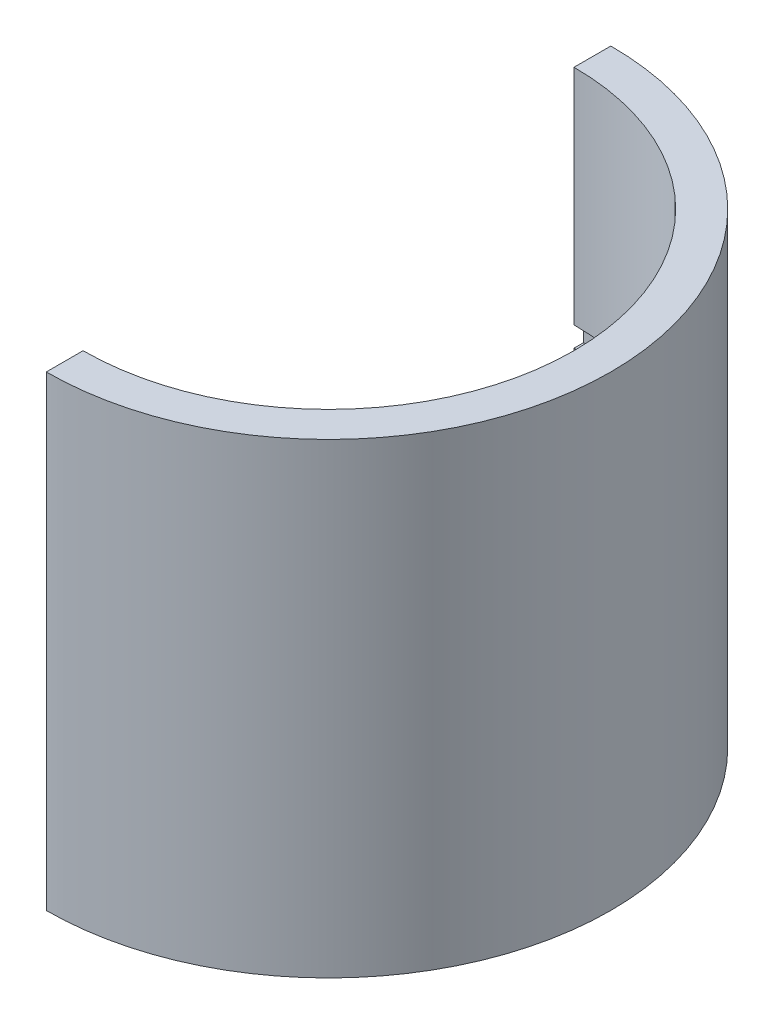
ISO-10303-21;
HEADER;
FILE_DESCRIPTION(('STEP AP214'),'2;1');
FILE_NAME('part.step','',(''),(''),'','','');
FILE_SCHEMA(('AUTOMOTIVE_DESIGN { 1 0 10303 214 1 1 1 1 }'));
ENDSEC;
DATA;
#1=APPLICATION_CONTEXT('core data for automotive mechanical design processes');
#2=APPLICATION_PROTOCOL_DEFINITION('international standard','automotive_design',2000,#1);
#3=PRODUCT_CONTEXT('',#1,'mechanical');
#4=PRODUCT('Part','Part','',(#3));
#5=PRODUCT_RELATED_PRODUCT_CATEGORY('part','',(#4));
#6=PRODUCT_DEFINITION_FORMATION('','',#4);
#7=PRODUCT_DEFINITION_CONTEXT('part definition',#1,'design');
#8=PRODUCT_DEFINITION('design','',#6,#7);
#9=PRODUCT_DEFINITION_SHAPE('','',#8);
#10=(LENGTH_UNIT() NAMED_UNIT(*) SI_UNIT(.MILLI.,.METRE.));
#11=(NAMED_UNIT(*) PLANE_ANGLE_UNIT() SI_UNIT($,.RADIAN.));
#12=(NAMED_UNIT(*) SI_UNIT($,.STERADIAN.) SOLID_ANGLE_UNIT());
#13=UNCERTAINTY_MEASURE_WITH_UNIT(LENGTH_MEASURE(1.E-05),#10,'distance_accuracy_value','');
#14=(GEOMETRIC_REPRESENTATION_CONTEXT(3) GLOBAL_UNCERTAINTY_ASSIGNED_CONTEXT((#13)) GLOBAL_UNIT_ASSIGNED_CONTEXT((#10,
#11,#12)) REPRESENTATION_CONTEXT('',''));
#15=CARTESIAN_POINT('',(0.,0.,0.));
#16=DIRECTION('',(0.,0.,1.));
#17=DIRECTION('',(1.,0.,0.));
#18=AXIS2_PLACEMENT_3D('',#15,#16,#17);
#19=CARTESIAN_POINT('',(0.,19.,0.));
#20=DIRECTION('',(0.,-1.,0.));
#21=DIRECTION('',(0.,0.,-1.));
#22=AXIS2_PLACEMENT_3D('',#19,#20,#21);
#23=CYLINDRICAL_SURFACE('',#22,10.);
#24=DIRECTION('',(0.,-1.,0.));
#25=VECTOR('',#24,1.);
#26=CARTESIAN_POINT('',(0.,19.,-10.));
#27=LINE('',#26,#25);
#28=CARTESIAN_POINT('',(0.,19.,-10.));
#29=VERTEX_POINT('',#28);
#30=CARTESIAN_POINT('',(0.,9.90994728555532,-10.));
#31=VERTEX_POINT('',#30);
#32=EDGE_CURVE('E146',#29,#31,#27,.T.);
#33=ORIENTED_EDGE('',*,*,#32,.T.);
#34=CARTESIAN_POINT('',(0.,9.90994728555532,0.));
#35=DIRECTION('',(0.,-1.,0.));
#36=DIRECTION('',(0.,0.,-1.));
#37=AXIS2_PLACEMENT_3D('',#34,#35,#36);
#38=CIRCLE('',#37,10.);
#39=CARTESIAN_POINT('',(0.,9.90994728555532,10.));
#40=VERTEX_POINT('',#39);
#41=EDGE_CURVE('E149',#31,#40,#38,.T.);
#42=ORIENTED_EDGE('',*,*,#41,.T.);
#43=DIRECTION('',(0.,-1.,0.));
#44=VECTOR('',#43,1.);
#45=CARTESIAN_POINT('',(0.,19.,10.));
#46=LINE('',#45,#44);
#47=CARTESIAN_POINT('',(0.,19.,10.));
#48=VERTEX_POINT('',#47);
#49=EDGE_CURVE('E49',#48,#40,#46,.T.);
#50=ORIENTED_EDGE('',*,*,#49,.F.);
#51=CARTESIAN_POINT('',(0.,19.,0.));
#52=DIRECTION('',(0.,1.,0.));
#53=DIRECTION('',(0.,0.,1.));
#54=AXIS2_PLACEMENT_3D('',#51,#52,#53);
#55=CIRCLE('',#54,10.);
#56=EDGE_CURVE('E154',#48,#29,#55,.T.);
#57=ORIENTED_EDGE('',*,*,#56,.T.);
#58=EDGE_LOOP('',(#33,#42,#50,#57));
#59=FACE_BOUND('',#58,.T.);
#60=ADVANCED_FACE('F45',(#59),#23,.F.);
#61=CARTESIAN_POINT('',(0.,19.,0.));
#62=DIRECTION('',(-1.,0.,0.));
#63=DIRECTION('',(0.,0.,1.));
#64=AXIS2_PLACEMENT_3D('',#61,#62,#63);
#65=PLANE('',#64);
#66=DIRECTION('',(0.,0.,1.));
#67=VECTOR('',#66,1.);
#68=CARTESIAN_POINT('',(0.,9.09005271444468,0.));
#69=LINE('',#68,#67);
#70=CARTESIAN_POINT('',(0.,9.09005271444468,10.));
#71=VERTEX_POINT('',#70);
#72=CARTESIAN_POINT('',(0.,9.09005271444468,10.385));
#73=VERTEX_POINT('',#72);
#74=EDGE_CURVE('E145',#71,#73,#69,.T.);
#75=ORIENTED_EDGE('',*,*,#74,.F.);
#76=CARTESIAN_POINT('',(0.,0.,10.));
#77=VERTEX_POINT('',#76);
#78=EDGE_CURVE('E136',#71,#77,#46,.T.);
#79=ORIENTED_EDGE('',*,*,#78,.T.);
#80=DIRECTION('',(0.,0.,-1.));
#81=VECTOR('',#80,1.);
#82=CARTESIAN_POINT('',(0.,0.,0.));
#83=LINE('',#82,#81);
#84=CARTESIAN_POINT('',(0.,0.,11.5));
#85=VERTEX_POINT('',#84);
#86=EDGE_CURVE('E166',#85,#77,#83,.T.);
#87=ORIENTED_EDGE('',*,*,#86,.F.);
#88=DIRECTION('',(0.,-1.,0.));
#89=VECTOR('',#88,1.);
#90=CARTESIAN_POINT('',(0.,19.,11.5));
#91=LINE('',#90,#89);
#92=CARTESIAN_POINT('',(0.,19.,11.5));
#93=VERTEX_POINT('',#92);
#94=EDGE_CURVE('E133',#93,#85,#91,.T.);
#95=ORIENTED_EDGE('',*,*,#94,.F.);
#96=DIRECTION('',(0.,0.,-1.));
#97=VECTOR('',#96,1.);
#98=CARTESIAN_POINT('',(0.,19.,0.));
#99=LINE('',#98,#97);
#100=EDGE_CURVE('E135',#93,#48,#99,.T.);
#101=ORIENTED_EDGE('',*,*,#100,.T.);
#102=ORIENTED_EDGE('',*,*,#49,.T.);
#103=DIRECTION('',(0.,0.,1.));
#104=VECTOR('',#103,1.);
#105=CARTESIAN_POINT('',(0.,9.90994728555532,0.));
#106=LINE('',#105,#104);
#107=CARTESIAN_POINT('',(0.,9.90994728555532,10.385));
#108=VERTEX_POINT('',#107);
#109=EDGE_CURVE('E63',#40,#108,#106,.T.);
#110=ORIENTED_EDGE('',*,*,#109,.T.);
#111=DIRECTION('',(0.,-1.,0.));
#112=VECTOR('',#111,1.);
#113=CARTESIAN_POINT('',(0.,-0.799894571110644,10.385));
#114=LINE('',#113,#112);
#115=EDGE_CURVE('E110',#73,#108,#114,.F.);
#116=ORIENTED_EDGE('',*,*,#115,.F.);
#117=EDGE_LOOP('',(#75,#79,#87,#95,#101,#102,#110,#116));
#118=FACE_BOUND('',#117,.T.);
#119=ADVANCED_FACE('F125',(#118),#65,.T.);
#120=CARTESIAN_POINT('',(0.,19.,0.));
#121=DIRECTION('',(0.,-1.,0.));
#122=DIRECTION('',(0.,0.,-1.));
#123=AXIS2_PLACEMENT_3D('',#120,#121,#122);
#124=CYLINDRICAL_SURFACE('',#123,11.5);
#125=CARTESIAN_POINT('',(0.,0.,0.));
#126=DIRECTION('',(0.,1.,0.));
#127=DIRECTION('',(0.,0.,1.));
#128=AXIS2_PLACEMENT_3D('',#125,#126,#127);
#129=CIRCLE('',#128,11.5);
#130=CARTESIAN_POINT('',(0.,0.,-11.5));
#131=VERTEX_POINT('',#130);
#132=EDGE_CURVE('E128',#85,#131,#129,.T.);
#133=ORIENTED_EDGE('',*,*,#132,.T.);
#134=DIRECTION('',(0.,-1.,0.));
#135=VECTOR('',#134,1.);
#136=CARTESIAN_POINT('',(0.,19.,-11.5));
#137=LINE('',#136,#135);
#138=CARTESIAN_POINT('',(0.,19.,-11.5));
#139=VERTEX_POINT('',#138);
#140=EDGE_CURVE('E158',#139,#131,#137,.T.);
#141=ORIENTED_EDGE('',*,*,#140,.F.);
#142=CARTESIAN_POINT('',(0.,19.,0.));
#143=DIRECTION('',(0.,1.,0.));
#144=DIRECTION('',(0.,0.,1.));
#145=AXIS2_PLACEMENT_3D('',#142,#143,#144);
#146=CIRCLE('',#145,11.5);
#147=EDGE_CURVE('E157',#93,#139,#146,.T.);
#148=ORIENTED_EDGE('',*,*,#147,.F.);
#149=ORIENTED_EDGE('',*,*,#94,.T.);
#150=EDGE_LOOP('',(#133,#141,#148,#149));
#151=FACE_BOUND('',#150,.T.);
#152=ADVANCED_FACE('F208',(#151),#124,.T.);
#153=DIRECTION('',(0.,0.,1.));
#154=VECTOR('',#153,1.);
#155=CARTESIAN_POINT('',(0.,9.09005271444468,0.));
#156=LINE('',#155,#154);
#157=CARTESIAN_POINT('',(0.,9.09005271444468,-10.385));
#158=VERTEX_POINT('',#157);
#159=CARTESIAN_POINT('',(0.,9.09005271444468,-10.));
#160=VERTEX_POINT('',#159);
#161=EDGE_CURVE('E139',#158,#160,#156,.T.);
#162=ORIENTED_EDGE('',*,*,#161,.F.);
#163=DIRECTION('',(0.,-1.,0.));
#164=VECTOR('',#163,1.);
#165=CARTESIAN_POINT('',(0.,-0.799894571110644,-10.385));
#166=LINE('',#165,#164);
#167=CARTESIAN_POINT('',(0.,9.90994728555532,-10.385));
#168=VERTEX_POINT('',#167);
#169=EDGE_CURVE('E118',#168,#158,#166,.T.);
#170=ORIENTED_EDGE('',*,*,#169,.F.);
#171=DIRECTION('',(0.,0.,1.));
#172=VECTOR('',#171,1.);
#173=CARTESIAN_POINT('',(0.,9.90994728555532,0.));
#174=LINE('',#173,#172);
#175=EDGE_CURVE('E123',#168,#31,#174,.T.);
#176=ORIENTED_EDGE('',*,*,#175,.T.);
#177=ORIENTED_EDGE('',*,*,#32,.F.);
#178=EDGE_CURVE('E143',#29,#139,#99,.T.);
#179=ORIENTED_EDGE('',*,*,#178,.T.);
#180=ORIENTED_EDGE('',*,*,#140,.T.);
#181=CARTESIAN_POINT('',(0.,0.,-10.));
#182=VERTEX_POINT('',#181);
#183=EDGE_CURVE('E119',#182,#131,#83,.T.);
#184=ORIENTED_EDGE('',*,*,#183,.F.);
#185=EDGE_CURVE('E150',#160,#182,#27,.T.);
#186=ORIENTED_EDGE('',*,*,#185,.F.);
#187=EDGE_LOOP('',(#162,#170,#176,#177,#179,#180,#184,#186));
#188=FACE_BOUND('',#187,.T.);
#189=ADVANCED_FACE('F47',(#188),#65,.T.);
#190=CARTESIAN_POINT('',(0.,9.09005271444468,0.));
#191=DIRECTION('',(0.,-1.,0.));
#192=DIRECTION('',(0.,0.,-1.));
#193=AXIS2_PLACEMENT_3D('',#190,#191,#192);
#194=CIRCLE('',#193,10.);
#195=EDGE_CURVE('E56',#160,#71,#194,.T.);
#196=ORIENTED_EDGE('',*,*,#195,.F.);
#197=ORIENTED_EDGE('',*,*,#185,.T.);
#198=CARTESIAN_POINT('',(0.,0.,0.));
#199=DIRECTION('',(0.,1.,0.));
#200=DIRECTION('',(0.,0.,1.));
#201=AXIS2_PLACEMENT_3D('',#198,#199,#200);
#202=CIRCLE('',#201,10.);
#203=EDGE_CURVE('E176',#77,#182,#202,.T.);
#204=ORIENTED_EDGE('',*,*,#203,.F.);
#205=ORIENTED_EDGE('',*,*,#78,.F.);
#206=EDGE_LOOP('',(#196,#197,#204,#205));
#207=FACE_BOUND('',#206,.T.);
#208=ADVANCED_FACE('F201',(#207),#23,.F.);
#209=CARTESIAN_POINT('',(0.,19.,0.));
#210=DIRECTION('',(0.,1.,0.));
#211=DIRECTION('',(0.,0.,1.));
#212=AXIS2_PLACEMENT_3D('',#209,#210,#211);
#213=PLANE('',#212);
#214=ORIENTED_EDGE('',*,*,#100,.F.);
#215=ORIENTED_EDGE('',*,*,#147,.T.);
#216=ORIENTED_EDGE('',*,*,#178,.F.);
#217=ORIENTED_EDGE('',*,*,#56,.F.);
#218=EDGE_LOOP('',(#214,#215,#216,#217));
#219=FACE_BOUND('',#218,.T.);
#220=ADVANCED_FACE('F211',(#219),#213,.T.);
#221=CARTESIAN_POINT('',(0.,0.,0.));
#222=DIRECTION('',(0.,1.,0.));
#223=DIRECTION('',(0.,0.,1.));
#224=AXIS2_PLACEMENT_3D('',#221,#222,#223);
#225=PLANE('',#224);
#226=ORIENTED_EDGE('',*,*,#86,.T.);
#227=ORIENTED_EDGE('',*,*,#203,.T.);
#228=ORIENTED_EDGE('',*,*,#183,.T.);
#229=ORIENTED_EDGE('',*,*,#132,.F.);
#230=EDGE_LOOP('',(#226,#227,#228,#229));
#231=FACE_BOUND('',#230,.T.);
#232=ADVANCED_FACE('F198',(#231),#225,.F.);
#233=CARTESIAN_POINT('',(0.,-0.799894571110644,0.));
#234=DIRECTION('',(0.,-1.,0.));
#235=DIRECTION('',(0.,0.,-1.));
#236=AXIS2_PLACEMENT_3D('',#233,#234,#235);
#237=CYLINDRICAL_SURFACE('',#236,10.385);
#238=ORIENTED_EDGE('',*,*,#115,.T.);
#239=CARTESIAN_POINT('',(0.,9.90994728555532,0.));
#240=DIRECTION('',(0.,-1.,0.));
#241=DIRECTION('',(0.,0.,-1.));
#242=AXIS2_PLACEMENT_3D('',#239,#240,#241);
#243=CIRCLE('',#242,10.385);
#244=EDGE_CURVE('E11',#168,#108,#243,.T.);
#245=ORIENTED_EDGE('',*,*,#244,.F.);
#246=ORIENTED_EDGE('',*,*,#169,.T.);
#247=CARTESIAN_POINT('',(0.,9.09005271444468,0.));
#248=DIRECTION('',(0.,-1.,0.));
#249=DIRECTION('',(0.,0.,-1.));
#250=AXIS2_PLACEMENT_3D('',#247,#248,#249);
#251=CIRCLE('',#250,10.385);
#252=EDGE_CURVE('E114',#158,#73,#251,.T.);
#253=ORIENTED_EDGE('',*,*,#252,.T.);
#254=EDGE_LOOP('',(#238,#245,#246,#253));
#255=FACE_BOUND('',#254,.T.);
#256=ADVANCED_FACE('F111',(#255),#237,.F.);
#257=CARTESIAN_POINT('',(0.,9.09005271444468,0.));
#258=DIRECTION('',(0.,-1.,0.));
#259=DIRECTION('',(0.,0.,-1.));
#260=AXIS2_PLACEMENT_3D('',#257,#258,#259);
#261=PLANE('',#260);
#262=ORIENTED_EDGE('',*,*,#74,.T.);
#263=ORIENTED_EDGE('',*,*,#252,.F.);
#264=ORIENTED_EDGE('',*,*,#161,.T.);
#265=ORIENTED_EDGE('',*,*,#195,.T.);
#266=EDGE_LOOP('',(#262,#263,#264,#265));
#267=FACE_BOUND('',#266,.T.);
#268=ADVANCED_FACE('F193',(#267),#261,.F.);
#269=CARTESIAN_POINT('',(0.,9.90994728555532,0.));
#270=DIRECTION('',(0.,-1.,0.));
#271=DIRECTION('',(0.,0.,-1.));
#272=AXIS2_PLACEMENT_3D('',#269,#270,#271);
#273=PLANE('',#272);
#274=ORIENTED_EDGE('',*,*,#41,.F.);
#275=ORIENTED_EDGE('',*,*,#175,.F.);
#276=ORIENTED_EDGE('',*,*,#244,.T.);
#277=ORIENTED_EDGE('',*,*,#109,.F.);
#278=EDGE_LOOP('',(#274,#275,#276,#277));
#279=FACE_BOUND('',#278,.T.);
#280=ADVANCED_FACE('F121',(#279),#273,.T.);
#281=CLOSED_SHELL('',(#60,#119,#152,#189,#208,#220,#232,#256,#268,#280));
#282=MANIFOLD_SOLID_BREP('B2',#281);
#283=ADVANCED_BREP_SHAPE_REPRESENTATION('',(#18,#282),#14);
#284=SHAPE_DEFINITION_REPRESENTATION(#9,#283);
ENDSEC;
END-ISO-10303-21;
